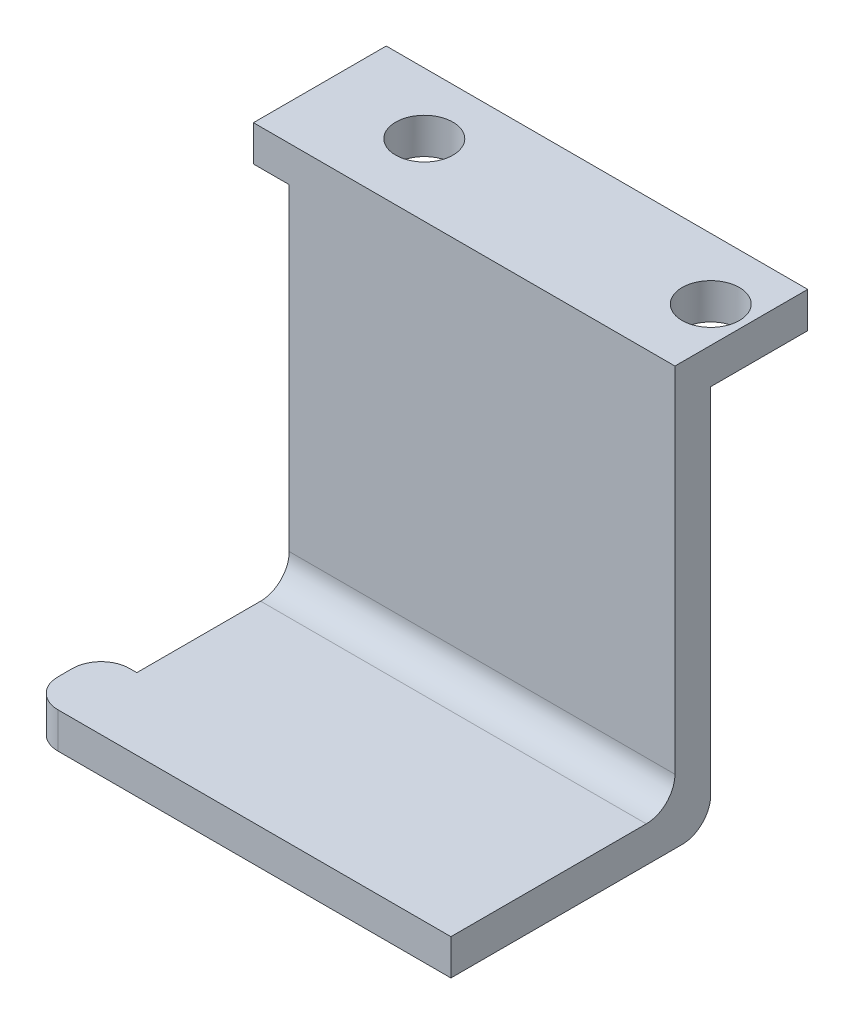
ISO-10303-21;
HEADER;
FILE_DESCRIPTION(('STEP AP214'),'2;1');
FILE_NAME('part.step','',(''),(''),'','','');
FILE_SCHEMA(('AUTOMOTIVE_DESIGN { 1 0 10303 214 1 1 1 1 }'));
ENDSEC;
DATA;
#1=APPLICATION_CONTEXT('core data for automotive mechanical design processes');
#2=APPLICATION_PROTOCOL_DEFINITION('international standard','automotive_design',2000,#1);
#3=PRODUCT_CONTEXT('',#1,'mechanical');
#4=PRODUCT('Part','Part','',(#3));
#5=PRODUCT_RELATED_PRODUCT_CATEGORY('part','',(#4));
#6=PRODUCT_DEFINITION_FORMATION('','',#4);
#7=PRODUCT_DEFINITION_CONTEXT('part definition',#1,'design');
#8=PRODUCT_DEFINITION('design','',#6,#7);
#9=PRODUCT_DEFINITION_SHAPE('','',#8);
#10=(LENGTH_UNIT() NAMED_UNIT(*) SI_UNIT(.MILLI.,.METRE.));
#11=(NAMED_UNIT(*) PLANE_ANGLE_UNIT() SI_UNIT($,.RADIAN.));
#12=(NAMED_UNIT(*) SI_UNIT($,.STERADIAN.) SOLID_ANGLE_UNIT());
#13=UNCERTAINTY_MEASURE_WITH_UNIT(LENGTH_MEASURE(1.E-05),#10,'distance_accuracy_value','');
#14=(GEOMETRIC_REPRESENTATION_CONTEXT(3) GLOBAL_UNCERTAINTY_ASSIGNED_CONTEXT((#13)) GLOBAL_UNIT_ASSIGNED_CONTEXT((#10,
#11,#12)) REPRESENTATION_CONTEXT('',''));
#15=CARTESIAN_POINT('',(0.,0.,0.));
#16=DIRECTION('',(0.,0.,1.));
#17=DIRECTION('',(1.,0.,0.));
#18=AXIS2_PLACEMENT_3D('',#15,#16,#17);
#19=CARTESIAN_POINT('',(-18.68805,-16.94434,3.175));
#20=DIRECTION('',(1.,0.,0.));
#21=DIRECTION('',(0.,0.,-1.));
#22=AXIS2_PLACEMENT_3D('',#19,#20,#21);
#23=PLANE('',#22);
#24=DIRECTION('',(0.,0.,-1.));
#25=VECTOR('',#24,1.);
#26=CARTESIAN_POINT('',(-18.68805,16.94434,40.6857114863208));
#27=LINE('',#26,#25);
#28=CARTESIAN_POINT('',(-18.68805,16.94434,3.175));
#29=VERTEX_POINT('',#28);
#30=CARTESIAN_POINT('',(-18.68805,16.94434,-8.60044));
#31=VERTEX_POINT('',#30);
#32=EDGE_CURVE('E150',#29,#31,#27,.T.);
#33=ORIENTED_EDGE('',*,*,#32,.F.);
#34=DIRECTION('',(0.,-1.,0.));
#35=VECTOR('',#34,1.);
#36=CARTESIAN_POINT('',(-18.68805,-16.94434,3.175));
#37=LINE('',#36,#35);
#38=CARTESIAN_POINT('',(-18.68805,20.11934,3.175));
#39=VERTEX_POINT('',#38);
#40=EDGE_CURVE('E153',#39,#29,#37,.T.);
#41=ORIENTED_EDGE('',*,*,#40,.F.);
#42=DIRECTION('',(0.,0.,-1.));
#43=VECTOR('',#42,1.);
#44=CARTESIAN_POINT('',(-18.68805,20.11934,40.6857114863208));
#45=LINE('',#44,#43);
#46=CARTESIAN_POINT('',(-18.68805,20.11934,-8.60044));
#47=VERTEX_POINT('',#46);
#48=EDGE_CURVE('E161',#39,#47,#45,.T.);
#49=ORIENTED_EDGE('',*,*,#48,.T.);
#50=DIRECTION('',(0.,1.,0.));
#51=VECTOR('',#50,1.);
#52=CARTESIAN_POINT('',(-18.68805,16.94434,-8.60044));
#53=LINE('',#52,#51);
#54=EDGE_CURVE('E156',#31,#47,#53,.T.);
#55=ORIENTED_EDGE('',*,*,#54,.F.);
#56=EDGE_LOOP('',(#33,#41,#49,#55));
#57=FACE_BOUND('',#56,.T.);
#58=ADVANCED_FACE('F44',(#57),#23,.F.);
#59=CARTESIAN_POINT('',(-18.68805,-16.94434,3.175));
#60=DIRECTION('',(0.,1.,0.));
#61=DIRECTION('',(0.,0.,1.));
#62=AXIS2_PLACEMENT_3D('',#59,#60,#61);
#63=PLANE('',#62);
#64=DIRECTION('',(0.,0.,-1.));
#65=VECTOR('',#64,1.);
#66=CARTESIAN_POINT('',(-15.51305,-16.94434,3.175));
#67=LINE('',#66,#65);
#68=CARTESIAN_POINT('',(-15.51305,-16.94434,16.69034));
#69=VERTEX_POINT('',#68);
#70=CARTESIAN_POINT('',(-15.51305,-16.94434,2.54));
#71=VERTEX_POINT('',#70);
#72=EDGE_CURVE('E263',#69,#71,#67,.T.);
#73=ORIENTED_EDGE('',*,*,#72,.T.);
#74=DIRECTION('',(1.,0.,0.));
#75=VECTOR('',#74,1.);
#76=CARTESIAN_POINT('',(18.68805,-16.94434,2.54));
#77=LINE('',#76,#75);
#78=CARTESIAN_POINT('',(18.68805,-16.94434,2.54));
#79=VERTEX_POINT('',#78);
#80=EDGE_CURVE('E250',#71,#79,#77,.T.);
#81=ORIENTED_EDGE('',*,*,#80,.T.);
#82=DIRECTION('',(0.,0.,-1.));
#83=VECTOR('',#82,1.);
#84=CARTESIAN_POINT('',(18.68805,-16.94434,3.175));
#85=LINE('',#84,#83);
#86=CARTESIAN_POINT('',(18.68805,-16.94434,23.04034));
#87=VERTEX_POINT('',#86);
#88=EDGE_CURVE('E181',#87,#79,#85,.T.);
#89=ORIENTED_EDGE('',*,*,#88,.F.);
#90=DIRECTION('',(-1.,0.,0.));
#91=VECTOR('',#90,1.);
#92=CARTESIAN_POINT('',(18.68805,-16.94434,23.04034));
#93=LINE('',#92,#91);
#94=CARTESIAN_POINT('',(-16.14805,-16.94434,23.04034));
#95=VERTEX_POINT('',#94);
#96=EDGE_CURVE('E275',#87,#95,#93,.T.);
#97=ORIENTED_EDGE('',*,*,#96,.T.);
#98=CARTESIAN_POINT('',(-16.14805,-16.94434,20.50034));
#99=DIRECTION('',(0.,1.,0.));
#100=DIRECTION('',(0.,0.,1.));
#101=AXIS2_PLACEMENT_3D('',#98,#99,#100);
#102=CIRCLE('',#101,2.54);
#103=CARTESIAN_POINT('',(-18.68805,-16.94434,20.50034));
#104=VERTEX_POINT('',#103);
#105=EDGE_CURVE('E237',#95,#104,#102,.F.);
#106=ORIENTED_EDGE('',*,*,#105,.T.);
#107=DIRECTION('',(0.,0.,-1.));
#108=VECTOR('',#107,1.);
#109=CARTESIAN_POINT('',(-18.68805,-16.94434,3.175));
#110=LINE('',#109,#108);
#111=CARTESIAN_POINT('',(-18.68805,-16.94434,19.23034));
#112=VERTEX_POINT('',#111);
#113=EDGE_CURVE('E186',#104,#112,#110,.T.);
#114=ORIENTED_EDGE('',*,*,#113,.T.);
#115=CARTESIAN_POINT('',(-16.14805,-16.94434,19.23034));
#116=DIRECTION('',(0.,1.,0.));
#117=DIRECTION('',(0.,0.,1.));
#118=AXIS2_PLACEMENT_3D('',#115,#116,#117);
#119=CIRCLE('',#118,2.54);
#120=CARTESIAN_POINT('',(-16.14805,-16.94434,16.69034));
#121=VERTEX_POINT('',#120);
#122=EDGE_CURVE('E234',#112,#121,#119,.F.);
#123=ORIENTED_EDGE('',*,*,#122,.T.);
#124=DIRECTION('',(1.,0.,0.));
#125=VECTOR('',#124,1.);
#126=CARTESIAN_POINT('',(-18.68805,-16.94434,16.69034));
#127=LINE('',#126,#125);
#128=EDGE_CURVE('E303',#121,#69,#127,.T.);
#129=ORIENTED_EDGE('',*,*,#128,.T.);
#130=EDGE_LOOP('',(#73,#81,#89,#97,#106,#114,#123,#129));
#131=FACE_BOUND('',#130,.T.);
#132=ADVANCED_FACE('F259',(#131),#63,.F.);
#133=CARTESIAN_POINT('',(0.,0.,3.175));
#134=DIRECTION('',(0.,0.,-1.));
#135=DIRECTION('',(-1.,0.,0.));
#136=AXIS2_PLACEMENT_3D('',#133,#134,#135);
#137=PLANE('',#136);
#138=DIRECTION('',(0.,1.,0.));
#139=VECTOR('',#138,1.);
#140=CARTESIAN_POINT('',(-15.51305,16.94434,3.175));
#141=LINE('',#140,#139);
#142=CARTESIAN_POINT('',(-15.51305,-11.22934,3.175));
#143=VERTEX_POINT('',#142);
#144=CARTESIAN_POINT('',(-15.51305,16.94434,3.175));
#145=VERTEX_POINT('',#144);
#146=EDGE_CURVE('E360',#143,#145,#141,.T.);
#147=ORIENTED_EDGE('',*,*,#146,.F.);
#148=DIRECTION('',(1.,0.,0.));
#149=VECTOR('',#148,1.);
#150=CARTESIAN_POINT('',(0.,-11.22934,3.175));
#151=LINE('',#150,#149);
#152=CARTESIAN_POINT('',(18.68805,-11.22934,3.175));
#153=VERTEX_POINT('',#152);
#154=EDGE_CURVE('E201',#143,#153,#151,.T.);
#155=ORIENTED_EDGE('',*,*,#154,.T.);
#156=DIRECTION('',(0.,1.,0.));
#157=VECTOR('',#156,1.);
#158=CARTESIAN_POINT('',(18.68805,-16.94434,3.175));
#159=LINE('',#158,#157);
#160=CARTESIAN_POINT('',(18.68805,20.11934,3.175));
#161=VERTEX_POINT('',#160);
#162=EDGE_CURVE('E182',#153,#161,#159,.T.);
#163=ORIENTED_EDGE('',*,*,#162,.T.);
#164=DIRECTION('',(-1.,0.,0.));
#165=VECTOR('',#164,1.);
#166=CARTESIAN_POINT('',(18.68805,20.11934,3.175));
#167=LINE('',#166,#165);
#168=EDGE_CURVE('E178',#161,#39,#167,.T.);
#169=ORIENTED_EDGE('',*,*,#168,.T.);
#170=ORIENTED_EDGE('',*,*,#40,.T.);
#171=DIRECTION('',(1.,0.,0.));
#172=VECTOR('',#171,1.);
#173=CARTESIAN_POINT('',(-18.68805,16.94434,3.175));
#174=LINE('',#173,#172);
#175=EDGE_CURVE('E166',#29,#145,#174,.T.);
#176=ORIENTED_EDGE('',*,*,#175,.T.);
#177=EDGE_LOOP('',(#147,#155,#163,#169,#170,#176));
#178=FACE_BOUND('',#177,.T.);
#179=ADVANCED_FACE('F176',(#178),#137,.F.);
#180=CARTESIAN_POINT('',(0.,0.,0.));
#181=DIRECTION('',(0.,0.,-1.));
#182=DIRECTION('',(-1.,0.,0.));
#183=AXIS2_PLACEMENT_3D('',#180,#181,#182);
#184=PLANE('',#183);
#185=DIRECTION('',(0.,1.,0.));
#186=VECTOR('',#185,1.);
#187=CARTESIAN_POINT('',(18.68805,-16.94434,0.));
#188=LINE('',#187,#186);
#189=CARTESIAN_POINT('',(18.68805,-14.40434,0.));
#190=VERTEX_POINT('',#189);
#191=CARTESIAN_POINT('',(18.68805,16.94434,0.));
#192=VERTEX_POINT('',#191);
#193=EDGE_CURVE('E192',#190,#192,#188,.T.);
#194=ORIENTED_EDGE('',*,*,#193,.F.);
#195=DIRECTION('',(1.,0.,0.));
#196=VECTOR('',#195,1.);
#197=CARTESIAN_POINT('',(-15.51305,-14.40434,0.));
#198=LINE('',#197,#196);
#199=CARTESIAN_POINT('',(-15.51305,-14.40434,0.));
#200=VERTEX_POINT('',#199);
#201=EDGE_CURVE('E53',#190,#200,#198,.F.);
#202=ORIENTED_EDGE('',*,*,#201,.T.);
#203=DIRECTION('',(0.,-1.,0.));
#204=VECTOR('',#203,1.);
#205=CARTESIAN_POINT('',(-15.51305,16.94434,0.));
#206=LINE('',#205,#204);
#207=CARTESIAN_POINT('',(-15.51305,16.94434,0.));
#208=VERTEX_POINT('',#207);
#209=EDGE_CURVE('E357',#208,#200,#206,.T.);
#210=ORIENTED_EDGE('',*,*,#209,.F.);
#211=DIRECTION('',(-1.,0.,0.));
#212=VECTOR('',#211,1.);
#213=CARTESIAN_POINT('',(-18.68805,16.94434,0.));
#214=LINE('',#213,#212);
#215=EDGE_CURVE('E188',#192,#208,#214,.T.);
#216=ORIENTED_EDGE('',*,*,#215,.F.);
#217=EDGE_LOOP('',(#194,#202,#210,#216));
#218=FACE_BOUND('',#217,.T.);
#219=ADVANCED_FACE('F356',(#218),#184,.T.);
#220=CARTESIAN_POINT('',(18.68805,-16.94434,3.175));
#221=DIRECTION('',(-1.,0.,0.));
#222=DIRECTION('',(0.,0.,1.));
#223=AXIS2_PLACEMENT_3D('',#220,#221,#222);
#224=PLANE('',#223);
#225=ORIENTED_EDGE('',*,*,#88,.T.);
#226=CARTESIAN_POINT('',(18.68805,-14.40434,2.54));
#227=DIRECTION('',(-1.,0.,0.));
#228=DIRECTION('',(0.,0.,1.));
#229=AXIS2_PLACEMENT_3D('',#226,#227,#228);
#230=CIRCLE('',#229,2.54);
#231=EDGE_CURVE('E67',#79,#190,#230,.F.);
#232=ORIENTED_EDGE('',*,*,#231,.T.);
#233=ORIENTED_EDGE('',*,*,#193,.T.);
#234=DIRECTION('',(0.,0.,-1.));
#235=VECTOR('',#234,1.);
#236=CARTESIAN_POINT('',(18.68805,16.94434,40.6857114863208));
#237=LINE('',#236,#235);
#238=CARTESIAN_POINT('',(18.68805,16.94434,-8.60044));
#239=VERTEX_POINT('',#238);
#240=EDGE_CURVE('E162',#192,#239,#237,.T.);
#241=ORIENTED_EDGE('',*,*,#240,.T.);
#242=DIRECTION('',(0.,-1.,0.));
#243=VECTOR('',#242,1.);
#244=CARTESIAN_POINT('',(18.68805,16.94434,-8.60044));
#245=LINE('',#244,#243);
#246=CARTESIAN_POINT('',(18.68805,20.11934,-8.60044));
#247=VERTEX_POINT('',#246);
#248=EDGE_CURVE('E211',#247,#239,#245,.T.);
#249=ORIENTED_EDGE('',*,*,#248,.F.);
#250=DIRECTION('',(0.,0.,-1.));
#251=VECTOR('',#250,1.);
#252=CARTESIAN_POINT('',(18.68805,20.11934,40.6857114863208));
#253=LINE('',#252,#251);
#254=EDGE_CURVE('E281',#161,#247,#253,.T.);
#255=ORIENTED_EDGE('',*,*,#254,.F.);
#256=ORIENTED_EDGE('',*,*,#162,.F.);
#257=CARTESIAN_POINT('',(18.68805,-11.22934,5.715));
#258=DIRECTION('',(-1.,0.,0.));
#259=DIRECTION('',(0.,0.,1.));
#260=AXIS2_PLACEMENT_3D('',#257,#258,#259);
#261=CIRCLE('',#260,2.54);
#262=CARTESIAN_POINT('',(18.68805,-13.76934,5.715));
#263=VERTEX_POINT('',#262);
#264=EDGE_CURVE('E244',#153,#263,#261,.T.);
#265=ORIENTED_EDGE('',*,*,#264,.T.);
#266=DIRECTION('',(0.,0.,-1.));
#267=VECTOR('',#266,1.);
#268=CARTESIAN_POINT('',(18.68805,-13.76934,23.04034));
#269=LINE('',#268,#267);
#270=CARTESIAN_POINT('',(18.68805,-13.76934,23.04034));
#271=VERTEX_POINT('',#270);
#272=EDGE_CURVE('E195',#271,#263,#269,.T.);
#273=ORIENTED_EDGE('',*,*,#272,.F.);
#274=DIRECTION('',(0.,-1.,0.));
#275=VECTOR('',#274,1.);
#276=CARTESIAN_POINT('',(18.68805,-13.76934,23.04034));
#277=LINE('',#276,#275);
#278=EDGE_CURVE('E270',#271,#87,#277,.T.);
#279=ORIENTED_EDGE('',*,*,#278,.T.);
#280=EDGE_LOOP('',(#225,#232,#233,#241,#249,#255,#256,#265,#273,#279));
#281=FACE_BOUND('',#280,.T.);
#282=ADVANCED_FACE('F267',(#281),#224,.F.);
#283=ORIENTED_EDGE('',*,*,#113,.F.);
#284=DIRECTION('',(0.,1.,0.));
#285=VECTOR('',#284,1.);
#286=CARTESIAN_POINT('',(-18.68805,-16.94434,20.50034));
#287=LINE('',#286,#285);
#288=CARTESIAN_POINT('',(-18.68805,-13.76934,20.50034));
#289=VERTEX_POINT('',#288);
#290=EDGE_CURVE('E227',#104,#289,#287,.T.);
#291=ORIENTED_EDGE('',*,*,#290,.T.);
#292=DIRECTION('',(0.,0.,-1.));
#293=VECTOR('',#292,1.);
#294=CARTESIAN_POINT('',(-18.68805,-13.76934,23.04034));
#295=LINE('',#294,#293);
#296=CARTESIAN_POINT('',(-18.68805,-13.76934,19.23034));
#297=VERTEX_POINT('',#296);
#298=EDGE_CURVE('E287',#289,#297,#295,.T.);
#299=ORIENTED_EDGE('',*,*,#298,.T.);
#300=DIRECTION('',(0.,1.,0.));
#301=VECTOR('',#300,1.);
#302=CARTESIAN_POINT('',(-18.68805,-16.94434,19.23034));
#303=LINE('',#302,#301);
#304=EDGE_CURVE('E224',#297,#112,#303,.F.);
#305=ORIENTED_EDGE('',*,*,#304,.T.);
#306=EDGE_LOOP('',(#283,#291,#299,#305));
#307=FACE_BOUND('',#306,.T.);
#308=ADVANCED_FACE('F295',(#307),#23,.F.);
#309=CARTESIAN_POINT('',(18.68805,-13.76934,23.04034));
#310=DIRECTION('',(0.,1.,0.));
#311=DIRECTION('',(0.,0.,1.));
#312=AXIS2_PLACEMENT_3D('',#309,#310,#311);
#313=PLANE('',#312);
#314=ORIENTED_EDGE('',*,*,#272,.T.);
#315=DIRECTION('',(1.,0.,0.));
#316=VECTOR('',#315,1.);
#317=CARTESIAN_POINT('',(18.68805,-13.76934,5.715));
#318=LINE('',#317,#316);
#319=CARTESIAN_POINT('',(-15.51305,-13.76934,5.715));
#320=VERTEX_POINT('',#319);
#321=EDGE_CURVE('E221',#263,#320,#318,.F.);
#322=ORIENTED_EDGE('',*,*,#321,.T.);
#323=DIRECTION('',(0.,0.,-1.));
#324=VECTOR('',#323,1.);
#325=CARTESIAN_POINT('',(-15.51305,-13.76934,3.175));
#326=LINE('',#325,#324);
#327=CARTESIAN_POINT('',(-15.51305,-13.76934,16.69034));
#328=VERTEX_POINT('',#327);
#329=EDGE_CURVE('E311',#328,#320,#326,.T.);
#330=ORIENTED_EDGE('',*,*,#329,.F.);
#331=DIRECTION('',(1.,0.,0.));
#332=VECTOR('',#331,1.);
#333=CARTESIAN_POINT('',(-18.68805,-13.76934,16.69034));
#334=LINE('',#333,#332);
#335=CARTESIAN_POINT('',(-16.14805,-13.76934,16.69034));
#336=VERTEX_POINT('',#335);
#337=EDGE_CURVE('E174',#336,#328,#334,.T.);
#338=ORIENTED_EDGE('',*,*,#337,.F.);
#339=CARTESIAN_POINT('',(-16.14805,-13.76934,19.23034));
#340=DIRECTION('',(0.,1.,0.));
#341=DIRECTION('',(0.,0.,1.));
#342=AXIS2_PLACEMENT_3D('',#339,#340,#341);
#343=CIRCLE('',#342,2.54);
#344=EDGE_CURVE('E215',#336,#297,#343,.T.);
#345=ORIENTED_EDGE('',*,*,#344,.T.);
#346=ORIENTED_EDGE('',*,*,#298,.F.);
#347=CARTESIAN_POINT('',(-16.14805,-13.76934,20.50034));
#348=DIRECTION('',(0.,1.,0.));
#349=DIRECTION('',(0.,0.,1.));
#350=AXIS2_PLACEMENT_3D('',#347,#348,#349);
#351=CIRCLE('',#350,2.54);
#352=CARTESIAN_POINT('',(-16.14805,-13.76934,23.04034));
#353=VERTEX_POINT('',#352);
#354=EDGE_CURVE('E218',#289,#353,#351,.T.);
#355=ORIENTED_EDGE('',*,*,#354,.T.);
#356=DIRECTION('',(1.,0.,0.));
#357=VECTOR('',#356,1.);
#358=CARTESIAN_POINT('',(18.68805,-13.76934,23.04034));
#359=LINE('',#358,#357);
#360=EDGE_CURVE('E279',#353,#271,#359,.T.);
#361=ORIENTED_EDGE('',*,*,#360,.T.);
#362=EDGE_LOOP('',(#314,#322,#330,#338,#345,#346,#355,#361));
#363=FACE_BOUND('',#362,.T.);
#364=ADVANCED_FACE('F371',(#363),#313,.T.);
#365=CARTESIAN_POINT('',(0.,0.,23.04034));
#366=DIRECTION('',(0.,0.,-1.));
#367=DIRECTION('',(-1.,0.,0.));
#368=AXIS2_PLACEMENT_3D('',#365,#366,#367);
#369=PLANE('',#368);
#370=ORIENTED_EDGE('',*,*,#360,.F.);
#371=DIRECTION('',(0.,1.,0.));
#372=VECTOR('',#371,1.);
#373=CARTESIAN_POINT('',(-16.14805,0.,23.04034));
#374=LINE('',#373,#372);
#375=EDGE_CURVE('E231',#353,#95,#374,.F.);
#376=ORIENTED_EDGE('',*,*,#375,.T.);
#377=ORIENTED_EDGE('',*,*,#96,.F.);
#378=ORIENTED_EDGE('',*,*,#278,.F.);
#379=EDGE_LOOP('',(#370,#376,#377,#378));
#380=FACE_BOUND('',#379,.T.);
#381=ADVANCED_FACE('F374',(#380),#369,.F.);
#382=CARTESIAN_POINT('',(18.68805,20.11934,40.6857114863208));
#383=DIRECTION('',(0.,1.,0.));
#384=DIRECTION('',(0.,0.,1.));
#385=AXIS2_PLACEMENT_3D('',#382,#383,#384);
#386=PLANE('',#385);
#387=CARTESIAN_POINT('',(-9.88695,20.11934,-3.175));
#388=DIRECTION('',(0.,1.,0.));
#389=DIRECTION('',(0.,0.,1.));
#390=AXIS2_PLACEMENT_3D('',#387,#388,#389);
#391=CIRCLE('',#390,2.54);
#392=CARTESIAN_POINT('',(-9.88695,20.11934,-0.634999999999999));
#393=VERTEX_POINT('',#392);
#394=EDGE_CURVE('E207',#393,#393,#391,.T.);
#395=ORIENTED_EDGE('',*,*,#394,.F.);
#396=EDGE_LOOP('',(#395));
#397=FACE_BOUND('',#396,.T.);
#398=CARTESIAN_POINT('',(15.51305,20.11934,-3.175));
#399=DIRECTION('',(0.,1.,0.));
#400=DIRECTION('',(0.,0.,1.));
#401=AXIS2_PLACEMENT_3D('',#398,#399,#400);
#402=CIRCLE('',#401,2.54);
#403=CARTESIAN_POINT('',(15.51305,20.11934,-0.635000000000001));
#404=VERTEX_POINT('',#403);
#405=EDGE_CURVE('E324',#404,#404,#402,.T.);
#406=ORIENTED_EDGE('',*,*,#405,.F.);
#407=EDGE_LOOP('',(#406));
#408=FACE_BOUND('',#407,.T.);
#409=ORIENTED_EDGE('',*,*,#168,.F.);
#410=ORIENTED_EDGE('',*,*,#254,.T.);
#411=DIRECTION('',(1.,0.,0.));
#412=VECTOR('',#411,1.);
#413=CARTESIAN_POINT('',(18.68805,20.11934,-8.60044));
#414=LINE('',#413,#412);
#415=EDGE_CURVE('E339',#47,#247,#414,.T.);
#416=ORIENTED_EDGE('',*,*,#415,.F.);
#417=ORIENTED_EDGE('',*,*,#48,.F.);
#418=EDGE_LOOP('',(#409,#410,#416,#417));
#419=FACE_BOUND('',#418,.T.);
#420=ADVANCED_FACE('F351',(#397,#408,#419),#386,.T.);
#421=CARTESIAN_POINT('',(18.68805,16.94434,40.6857114863208));
#422=DIRECTION('',(0.,-1.,0.));
#423=DIRECTION('',(0.,0.,-1.));
#424=AXIS2_PLACEMENT_3D('',#421,#422,#423);
#425=PLANE('',#424);
#426=CARTESIAN_POINT('',(-9.88695,16.94434,-3.175));
#427=DIRECTION('',(0.,-1.,0.));
#428=DIRECTION('',(0.,0.,-1.));
#429=AXIS2_PLACEMENT_3D('',#426,#427,#428);
#430=CIRCLE('',#429,2.54);
#431=CARTESIAN_POINT('',(-9.88695,16.94434,-5.715));
#432=VERTEX_POINT('',#431);
#433=EDGE_CURVE('E206',#432,#432,#430,.T.);
#434=ORIENTED_EDGE('',*,*,#433,.F.);
#435=EDGE_LOOP('',(#434));
#436=FACE_BOUND('',#435,.T.);
#437=CARTESIAN_POINT('',(15.51305,16.94434,-3.175));
#438=DIRECTION('',(0.,-1.,0.));
#439=DIRECTION('',(0.,0.,-1.));
#440=AXIS2_PLACEMENT_3D('',#437,#438,#439);
#441=CIRCLE('',#440,2.54);
#442=CARTESIAN_POINT('',(15.51305,16.94434,-5.715));
#443=VERTEX_POINT('',#442);
#444=EDGE_CURVE('E202',#443,#443,#441,.T.);
#445=ORIENTED_EDGE('',*,*,#444,.F.);
#446=EDGE_LOOP('',(#445));
#447=FACE_BOUND('',#446,.T.);
#448=ORIENTED_EDGE('',*,*,#240,.F.);
#449=ORIENTED_EDGE('',*,*,#215,.T.);
#450=DIRECTION('',(0.,0.,-1.));
#451=VECTOR('',#450,1.);
#452=CARTESIAN_POINT('',(-15.51305,16.94434,0.));
#453=LINE('',#452,#451);
#454=EDGE_CURVE('E170',#145,#208,#453,.T.);
#455=ORIENTED_EDGE('',*,*,#454,.F.);
#456=ORIENTED_EDGE('',*,*,#175,.F.);
#457=ORIENTED_EDGE('',*,*,#32,.T.);
#458=DIRECTION('',(-1.,0.,0.));
#459=VECTOR('',#458,1.);
#460=CARTESIAN_POINT('',(18.68805,16.94434,-8.60044));
#461=LINE('',#460,#459);
#462=EDGE_CURVE('E334',#239,#31,#461,.T.);
#463=ORIENTED_EDGE('',*,*,#462,.F.);
#464=EDGE_LOOP('',(#448,#449,#455,#456,#457,#463));
#465=FACE_BOUND('',#464,.T.);
#466=ADVANCED_FACE('F168',(#436,#447,#465),#425,.T.);
#467=CARTESIAN_POINT('',(0.,0.,-8.60044));
#468=DIRECTION('',(0.,0.,1.));
#469=DIRECTION('',(1.,0.,0.));
#470=AXIS2_PLACEMENT_3D('',#467,#468,#469);
#471=PLANE('',#470);
#472=ORIENTED_EDGE('',*,*,#248,.T.);
#473=ORIENTED_EDGE('',*,*,#462,.T.);
#474=ORIENTED_EDGE('',*,*,#54,.T.);
#475=ORIENTED_EDGE('',*,*,#415,.T.);
#476=EDGE_LOOP('',(#472,#473,#474,#475));
#477=FACE_BOUND('',#476,.T.);
#478=ADVANCED_FACE('F349',(#477),#471,.F.);
#479=CARTESIAN_POINT('',(15.51305,-16.94434,-3.175));
#480=DIRECTION('',(0.,1.,0.));
#481=DIRECTION('',(0.,0.,1.));
#482=AXIS2_PLACEMENT_3D('',#479,#480,#481);
#483=CYLINDRICAL_SURFACE('',#482,2.54);
#484=ORIENTED_EDGE('',*,*,#444,.T.);
#485=EDGE_LOOP('',(#484));
#486=FACE_BOUND('',#485,.T.);
#487=ORIENTED_EDGE('',*,*,#405,.T.);
#488=EDGE_LOOP('',(#487));
#489=FACE_BOUND('',#488,.T.);
#490=ADVANCED_FACE('F419',(#486,#489),#483,.F.);
#491=CARTESIAN_POINT('',(-9.88695,-16.94434,-3.175));
#492=DIRECTION('',(0.,1.,0.));
#493=DIRECTION('',(0.,0.,1.));
#494=AXIS2_PLACEMENT_3D('',#491,#492,#493);
#495=CYLINDRICAL_SURFACE('',#494,2.54);
#496=ORIENTED_EDGE('',*,*,#433,.T.);
#497=EDGE_LOOP('',(#496));
#498=FACE_BOUND('',#497,.T.);
#499=ORIENTED_EDGE('',*,*,#394,.T.);
#500=EDGE_LOOP('',(#499));
#501=FACE_BOUND('',#500,.T.);
#502=ADVANCED_FACE('F422',(#498,#501),#495,.F.);
#503=CARTESIAN_POINT('',(-15.51305,-16.94434,3.175));
#504=DIRECTION('',(1.,0.,0.));
#505=DIRECTION('',(0.,0.,-1.));
#506=AXIS2_PLACEMENT_3D('',#503,#504,#505);
#507=PLANE('',#506);
#508=ORIENTED_EDGE('',*,*,#209,.T.);
#509=CARTESIAN_POINT('',(-15.51305,-14.40434,2.54));
#510=DIRECTION('',(1.,0.,0.));
#511=DIRECTION('',(0.,0.,-1.));
#512=AXIS2_PLACEMENT_3D('',#509,#510,#511);
#513=CIRCLE('',#512,2.54);
#514=EDGE_CURVE('E11',#200,#71,#513,.F.);
#515=ORIENTED_EDGE('',*,*,#514,.T.);
#516=ORIENTED_EDGE('',*,*,#72,.F.);
#517=DIRECTION('',(0.,1.,0.));
#518=VECTOR('',#517,1.);
#519=CARTESIAN_POINT('',(-15.51305,-16.94434,16.69034));
#520=LINE('',#519,#518);
#521=EDGE_CURVE('E309',#69,#328,#520,.T.);
#522=ORIENTED_EDGE('',*,*,#521,.T.);
#523=ORIENTED_EDGE('',*,*,#329,.T.);
#524=CARTESIAN_POINT('',(-15.51305,-11.22934,5.715));
#525=DIRECTION('',(1.,0.,0.));
#526=DIRECTION('',(0.,0.,-1.));
#527=AXIS2_PLACEMENT_3D('',#524,#525,#526);
#528=CIRCLE('',#527,2.54);
#529=EDGE_CURVE('E247',#320,#143,#528,.T.);
#530=ORIENTED_EDGE('',*,*,#529,.T.);
#531=ORIENTED_EDGE('',*,*,#146,.T.);
#532=ORIENTED_EDGE('',*,*,#454,.T.);
#533=EDGE_LOOP('',(#508,#515,#516,#522,#523,#530,#531,#532));
#534=FACE_BOUND('',#533,.T.);
#535=ADVANCED_FACE('F365',(#534),#507,.F.);
#536=CARTESIAN_POINT('',(-18.68805,-16.94434,16.69034));
#537=DIRECTION('',(0.,0.,1.));
#538=DIRECTION('',(1.,0.,0.));
#539=AXIS2_PLACEMENT_3D('',#536,#537,#538);
#540=PLANE('',#539);
#541=ORIENTED_EDGE('',*,*,#128,.F.);
#542=DIRECTION('',(0.,1.,0.));
#543=VECTOR('',#542,1.);
#544=CARTESIAN_POINT('',(-16.14805,-16.94434,16.69034));
#545=LINE('',#544,#543);
#546=EDGE_CURVE('E240',#121,#336,#545,.T.);
#547=ORIENTED_EDGE('',*,*,#546,.T.);
#548=ORIENTED_EDGE('',*,*,#337,.T.);
#549=ORIENTED_EDGE('',*,*,#521,.F.);
#550=EDGE_LOOP('',(#541,#547,#548,#549));
#551=FACE_BOUND('',#550,.T.);
#552=ADVANCED_FACE('F306',(#551),#540,.F.);
#553=CARTESIAN_POINT('',(0.,-11.22934,5.715));
#554=DIRECTION('',(1.,0.,0.));
#555=DIRECTION('',(0.,0.,-1.));
#556=AXIS2_PLACEMENT_3D('',#553,#554,#555);
#557=CYLINDRICAL_SURFACE('',#556,2.54);
#558=ORIENTED_EDGE('',*,*,#529,.F.);
#559=ORIENTED_EDGE('',*,*,#321,.F.);
#560=ORIENTED_EDGE('',*,*,#264,.F.);
#561=ORIENTED_EDGE('',*,*,#154,.F.);
#562=EDGE_LOOP('',(#558,#559,#560,#561));
#563=FACE_BOUND('',#562,.T.);
#564=ADVANCED_FACE('F369',(#563),#557,.F.);
#565=CARTESIAN_POINT('',(-16.14805,-16.94434,20.50034));
#566=DIRECTION('',(0.,1.,0.));
#567=DIRECTION('',(0.,0.,1.));
#568=AXIS2_PLACEMENT_3D('',#565,#566,#567);
#569=CYLINDRICAL_SURFACE('',#568,2.54);
#570=ORIENTED_EDGE('',*,*,#105,.F.);
#571=ORIENTED_EDGE('',*,*,#375,.F.);
#572=ORIENTED_EDGE('',*,*,#354,.F.);
#573=ORIENTED_EDGE('',*,*,#290,.F.);
#574=EDGE_LOOP('',(#570,#571,#572,#573));
#575=FACE_BOUND('',#574,.T.);
#576=ADVANCED_FACE('F377',(#575),#569,.T.);
#577=CARTESIAN_POINT('',(-16.14805,-16.94434,19.23034));
#578=DIRECTION('',(0.,1.,0.));
#579=DIRECTION('',(0.,0.,1.));
#580=AXIS2_PLACEMENT_3D('',#577,#578,#579);
#581=CYLINDRICAL_SURFACE('',#580,2.54);
#582=ORIENTED_EDGE('',*,*,#122,.F.);
#583=ORIENTED_EDGE('',*,*,#304,.F.);
#584=ORIENTED_EDGE('',*,*,#344,.F.);
#585=ORIENTED_EDGE('',*,*,#546,.F.);
#586=EDGE_LOOP('',(#582,#583,#584,#585));
#587=FACE_BOUND('',#586,.T.);
#588=ADVANCED_FACE('F300',(#587),#581,.T.);
#589=CARTESIAN_POINT('',(-18.68805,-14.40434,2.54));
#590=DIRECTION('',(-1.,0.,0.));
#591=DIRECTION('',(0.,0.,1.));
#592=AXIS2_PLACEMENT_3D('',#589,#590,#591);
#593=CYLINDRICAL_SURFACE('',#592,2.54);
#594=ORIENTED_EDGE('',*,*,#514,.F.);
#595=ORIENTED_EDGE('',*,*,#201,.F.);
#596=ORIENTED_EDGE('',*,*,#231,.F.);
#597=ORIENTED_EDGE('',*,*,#80,.F.);
#598=EDGE_LOOP('',(#594,#595,#596,#597));
#599=FACE_BOUND('',#598,.T.);
#600=ADVANCED_FACE('F46',(#599),#593,.T.);
#601=CLOSED_SHELL('',(#58,#132,#179,#219,#282,#308,#364,#381,#420,#466,#478,#490,#502,#535,#552,
#564,#576,#588,#600));
#602=MANIFOLD_SOLID_BREP('B2',#601);
#603=ADVANCED_BREP_SHAPE_REPRESENTATION('',(#18,#602),#14);
#604=SHAPE_DEFINITION_REPRESENTATION(#9,#603);
ENDSEC;
END-ISO-10303-21;
